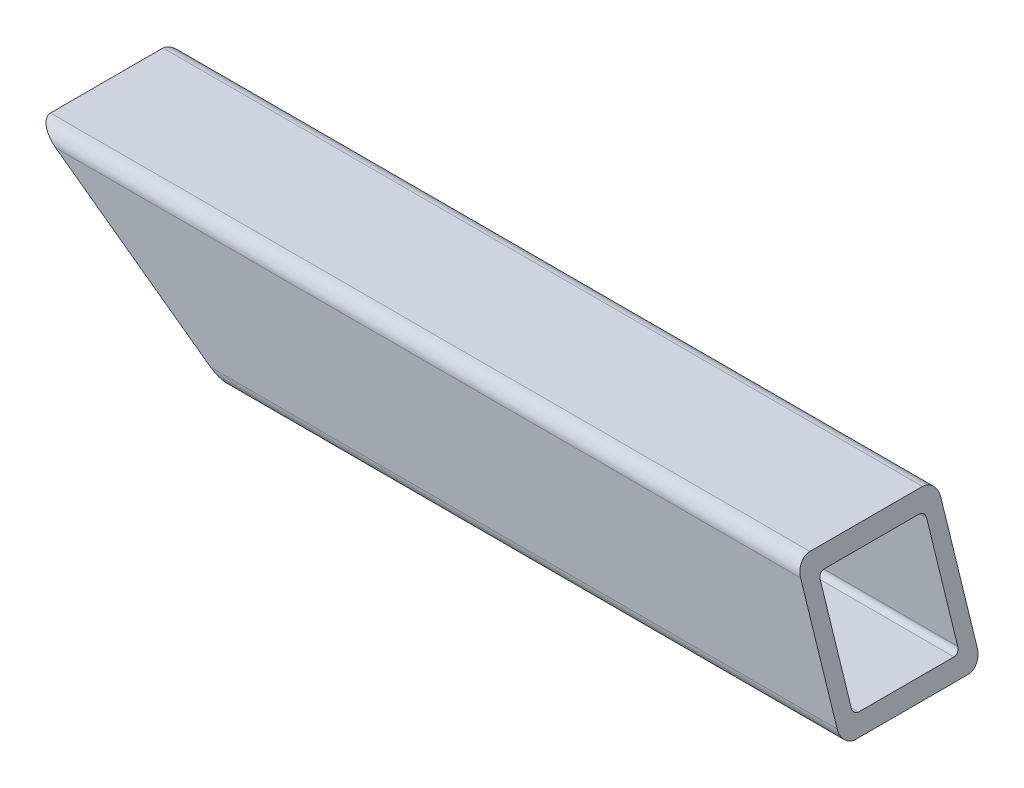
ISO-10303-21;
HEADER;
FILE_DESCRIPTION(('STEP AP214'),'2;1');
FILE_NAME('part.step','',(''),(''),'','','');
FILE_SCHEMA(('AUTOMOTIVE_DESIGN { 1 0 10303 214 1 1 1 1 }'));
ENDSEC;
DATA;
#1=APPLICATION_CONTEXT('core data for automotive mechanical design processes');
#2=APPLICATION_PROTOCOL_DEFINITION('international standard','automotive_design',2000,#1);
#3=PRODUCT_CONTEXT('',#1,'mechanical');
#4=PRODUCT('Part','Part','',(#3));
#5=PRODUCT_RELATED_PRODUCT_CATEGORY('part','',(#4));
#6=PRODUCT_DEFINITION_FORMATION('','',#4);
#7=PRODUCT_DEFINITION_CONTEXT('part definition',#1,'design');
#8=PRODUCT_DEFINITION('design','',#6,#7);
#9=PRODUCT_DEFINITION_SHAPE('','',#8);
#10=(LENGTH_UNIT() NAMED_UNIT(*) SI_UNIT(.MILLI.,.METRE.));
#11=(NAMED_UNIT(*) PLANE_ANGLE_UNIT() SI_UNIT($,.RADIAN.));
#12=(NAMED_UNIT(*) SI_UNIT($,.STERADIAN.) SOLID_ANGLE_UNIT());
#13=UNCERTAINTY_MEASURE_WITH_UNIT(LENGTH_MEASURE(1.E-05),#10,'distance_accuracy_value','');
#14=(GEOMETRIC_REPRESENTATION_CONTEXT(3) GLOBAL_UNCERTAINTY_ASSIGNED_CONTEXT((#13)) GLOBAL_UNIT_ASSIGNED_CONTEXT((#10,
#11,#12)) REPRESENTATION_CONTEXT('',''));
#15=CARTESIAN_POINT('',(0.,0.,0.));
#16=DIRECTION('',(0.,0.,1.));
#17=DIRECTION('',(1.,0.,0.));
#18=AXIS2_PLACEMENT_3D('',#15,#16,#17);
#19=CARTESIAN_POINT('',(-145.89,12.7,-12.7));
#20=DIRECTION('',(0.,0.,-1.));
#21=DIRECTION('',(0.,1.,0.));
#22=AXIS2_PLACEMENT_3D('',#19,#20,#21);
#23=PLANE('',#22);
#24=DIRECTION('',(-0.309016994374941,0.951056516295156,0.));
#25=VECTOR('',#24,1.);
#26=CARTESIAN_POINT('',(-8.25296028431564,12.7,-12.7));
#27=LINE('',#26,#25);
#28=CARTESIAN_POINT('',(-0.812299240582242,-10.2,-12.7));
#29=VERTEX_POINT('',#28);
#30=CARTESIAN_POINT('',(-7.44066104373339,10.2,-12.7));
#31=VERTEX_POINT('',#30);
#32=EDGE_CURVE('E146',#29,#31,#27,.T.);
#33=ORIENTED_EDGE('',*,*,#32,.F.);
#34=DIRECTION('',(1.,0.,0.));
#35=VECTOR('',#34,1.);
#36=CARTESIAN_POINT('',(-145.89,-10.2,-12.7));
#37=LINE('',#36,#35);
#38=CARTESIAN_POINT('',(-114.37085402121,-10.2,-12.7));
#39=VERTEX_POINT('',#38);
#40=EDGE_CURVE('E160',#29,#39,#37,.F.);
#41=ORIENTED_EDGE('',*,*,#40,.T.);
#42=DIRECTION('',(0.809016994374951,-0.587785252292468,0.));
#43=VECTOR('',#42,1.);
#44=CARTESIAN_POINT('',(-145.89,12.7,-12.7));
#45=LINE('',#44,#43);
#46=CARTESIAN_POINT('',(-142.449045198822,10.2,-12.7));
#47=VERTEX_POINT('',#46);
#48=EDGE_CURVE('E154',#47,#39,#45,.T.);
#49=ORIENTED_EDGE('',*,*,#48,.F.);
#50=DIRECTION('',(1.,0.,0.));
#51=VECTOR('',#50,1.);
#52=CARTESIAN_POINT('',(-145.89,10.2,-12.7));
#53=LINE('',#52,#51);
#54=EDGE_CURVE('E163',#47,#31,#53,.T.);
#55=ORIENTED_EDGE('',*,*,#54,.T.);
#56=EDGE_LOOP('',(#33,#41,#49,#55));
#57=FACE_BOUND('',#56,.T.);
#58=ADVANCED_FACE('F33',(#57),#23,.T.);
#59=CARTESIAN_POINT('',(-145.89,-12.7,12.7));
#60=DIRECTION('',(0.,-1.,0.));
#61=DIRECTION('',(0.,0.,-1.));
#62=AXIS2_PLACEMENT_3D('',#59,#60,#61);
#63=PLANE('',#62);
#64=DIRECTION('',(0.,0.,-1.));
#65=VECTOR('',#64,1.);
#66=CARTESIAN_POINT('',(-110.929899220032,-12.7,12.7));
#67=LINE('',#66,#65);
#68=CARTESIAN_POINT('',(-110.929899220032,-12.7,10.2));
#69=VERTEX_POINT('',#68);
#70=CARTESIAN_POINT('',(-110.929899220032,-12.7,-10.2));
#71=VERTEX_POINT('',#70);
#72=EDGE_CURVE('E225',#69,#71,#67,.T.);
#73=ORIENTED_EDGE('',*,*,#72,.T.);
#74=DIRECTION('',(1.,0.,0.));
#75=VECTOR('',#74,1.);
#76=CARTESIAN_POINT('',(-145.89,-12.7,-10.2));
#77=LINE('',#76,#75);
#78=CARTESIAN_POINT('',(0.,-12.7,-10.2));
#79=VERTEX_POINT('',#78);
#80=EDGE_CURVE('E173',#71,#79,#77,.T.);
#81=ORIENTED_EDGE('',*,*,#80,.T.);
#82=DIRECTION('',(0.,0.,-1.));
#83=VECTOR('',#82,1.);
#84=CARTESIAN_POINT('',(0.,-12.7,12.7));
#85=LINE('',#84,#83);
#86=CARTESIAN_POINT('',(0.,-12.7,10.2));
#87=VERTEX_POINT('',#86);
#88=EDGE_CURVE('E149',#87,#79,#85,.T.);
#89=ORIENTED_EDGE('',*,*,#88,.F.);
#90=DIRECTION('',(1.,0.,0.));
#91=VECTOR('',#90,1.);
#92=CARTESIAN_POINT('',(-145.89,-12.7,10.2));
#93=LINE('',#92,#91);
#94=EDGE_CURVE('E249',#87,#69,#93,.F.);
#95=ORIENTED_EDGE('',*,*,#94,.T.);
#96=EDGE_LOOP('',(#73,#81,#89,#95));
#97=FACE_BOUND('',#96,.T.);
#98=ADVANCED_FACE('F254',(#97),#63,.T.);
#99=CARTESIAN_POINT('',(-145.89,12.7,12.7));
#100=DIRECTION('',(0.,0.,1.));
#101=DIRECTION('',(0.,-1.,0.));
#102=AXIS2_PLACEMENT_3D('',#99,#100,#101);
#103=PLANE('',#102);
#104=DIRECTION('',(-0.309016994374941,0.951056516295156,0.));
#105=VECTOR('',#104,1.);
#106=CARTESIAN_POINT('',(-8.25296028431564,12.7,12.7));
#107=LINE('',#106,#105);
#108=CARTESIAN_POINT('',(-0.812299240582243,-10.2,12.7));
#109=VERTEX_POINT('',#108);
#110=CARTESIAN_POINT('',(-7.44066104373339,10.2,12.7));
#111=VERTEX_POINT('',#110);
#112=EDGE_CURVE('E164',#109,#111,#107,.T.);
#113=ORIENTED_EDGE('',*,*,#112,.T.);
#114=DIRECTION('',(1.,0.,0.));
#115=VECTOR('',#114,1.);
#116=CARTESIAN_POINT('',(-145.89,10.2,12.7));
#117=LINE('',#116,#115);
#118=CARTESIAN_POINT('',(-142.449045198822,10.2,12.7));
#119=VERTEX_POINT('',#118);
#120=EDGE_CURVE('E169',#111,#119,#117,.F.);
#121=ORIENTED_EDGE('',*,*,#120,.T.);
#122=DIRECTION('',(0.809016994374951,-0.587785252292468,0.));
#123=VECTOR('',#122,1.);
#124=CARTESIAN_POINT('',(-145.89,12.7,12.7));
#125=LINE('',#124,#123);
#126=CARTESIAN_POINT('',(-114.37085402121,-10.2,12.7));
#127=VERTEX_POINT('',#126);
#128=EDGE_CURVE('E258',#119,#127,#125,.T.);
#129=ORIENTED_EDGE('',*,*,#128,.T.);
#130=DIRECTION('',(1.,0.,0.));
#131=VECTOR('',#130,1.);
#132=CARTESIAN_POINT('',(-145.89,-10.2,12.7));
#133=LINE('',#132,#131);
#134=EDGE_CURVE('E171',#127,#109,#133,.T.);
#135=ORIENTED_EDGE('',*,*,#134,.T.);
#136=EDGE_LOOP('',(#113,#121,#129,#135));
#137=FACE_BOUND('',#136,.T.);
#138=ADVANCED_FACE('F291',(#137),#103,.T.);
#139=CARTESIAN_POINT('',(-145.89,12.7,12.7));
#140=DIRECTION('',(0.,1.,0.));
#141=DIRECTION('',(0.,0.,1.));
#142=AXIS2_PLACEMENT_3D('',#139,#140,#141);
#143=PLANE('',#142);
#144=DIRECTION('',(0.,0.,-1.));
#145=VECTOR('',#144,1.);
#146=CARTESIAN_POINT('',(-8.25296028431564,12.7,12.7));
#147=LINE('',#146,#145);
#148=CARTESIAN_POINT('',(-8.25296028431563,12.7,10.2));
#149=VERTEX_POINT('',#148);
#150=CARTESIAN_POINT('',(-8.25296028431561,12.7,-10.2));
#151=VERTEX_POINT('',#150);
#152=EDGE_CURVE('E48',#149,#151,#147,.T.);
#153=ORIENTED_EDGE('',*,*,#152,.T.);
#154=DIRECTION('',(1.,0.,0.));
#155=VECTOR('',#154,1.);
#156=CARTESIAN_POINT('',(-145.89,12.7,-10.2));
#157=LINE('',#156,#155);
#158=CARTESIAN_POINT('',(-145.89,12.7,-10.2));
#159=VERTEX_POINT('',#158);
#160=EDGE_CURVE('E182',#151,#159,#157,.F.);
#161=ORIENTED_EDGE('',*,*,#160,.T.);
#162=DIRECTION('',(0.,0.,1.));
#163=VECTOR('',#162,1.);
#164=CARTESIAN_POINT('',(-145.89,12.7,12.7));
#165=LINE('',#164,#163);
#166=CARTESIAN_POINT('',(-145.89,12.7,10.2));
#167=VERTEX_POINT('',#166);
#168=EDGE_CURVE('E246',#159,#167,#165,.T.);
#169=ORIENTED_EDGE('',*,*,#168,.T.);
#170=DIRECTION('',(1.,0.,0.));
#171=VECTOR('',#170,1.);
#172=CARTESIAN_POINT('',(-145.89,12.7,10.2));
#173=LINE('',#172,#171);
#174=EDGE_CURVE('E179',#167,#149,#173,.T.);
#175=ORIENTED_EDGE('',*,*,#174,.T.);
#176=EDGE_LOOP('',(#153,#161,#169,#175));
#177=FACE_BOUND('',#176,.T.);
#178=ADVANCED_FACE('F302',(#177),#143,.T.);
#179=CARTESIAN_POINT('',(-145.89,-9.652,-9.652));
#180=DIRECTION('',(0.,0.,-1.));
#181=DIRECTION('',(-1.,0.,0.));
#182=AXIS2_PLACEMENT_3D('',#179,#180,#181);
#183=PLANE('',#182);
#184=DIRECTION('',(1.,0.,0.));
#185=VECTOR('',#184,1.);
#186=CARTESIAN_POINT('',(0.,-8.652,-9.652));
#187=LINE('',#186,#185);
#188=CARTESIAN_POINT('',(-116.501493234099,-8.652,-9.652));
#189=VERTEX_POINT('',#188);
#190=CARTESIAN_POINT('',(-1.31527493035077,-8.652,-9.652));
#191=VERTEX_POINT('',#190);
#192=EDGE_CURVE('E186',#189,#191,#187,.T.);
#193=ORIENTED_EDGE('',*,*,#192,.T.);
#194=DIRECTION('',(-0.309016994374941,0.951056516295156,0.));
#195=VECTOR('',#194,1.);
#196=CARTESIAN_POINT('',(-14.8270400698126,32.9329371279011,-9.652));
#197=LINE('',#196,#195);
#198=CARTESIAN_POINT('',(-6.93768535396486,8.652,-9.652));
#199=VERTEX_POINT('',#198);
#200=EDGE_CURVE('E271',#191,#199,#197,.T.);
#201=ORIENTED_EDGE('',*,*,#200,.T.);
#202=DIRECTION('',(1.,0.,0.));
#203=VECTOR('',#202,1.);
#204=CARTESIAN_POINT('',(-145.89,8.652,-9.652));
#205=LINE('',#204,#203);
#206=CARTESIAN_POINT('',(-140.318405985933,8.652,-9.652));
#207=VERTEX_POINT('',#206);
#208=EDGE_CURVE('E184',#199,#207,#205,.F.);
#209=ORIENTED_EDGE('',*,*,#208,.T.);
#210=DIRECTION('',(0.809016994374951,-0.587785252292468,0.));
#211=VECTOR('',#210,1.);
#212=CARTESIAN_POINT('',(-135.260992373885,4.97757392913451,-9.652));
#213=LINE('',#212,#211);
#214=EDGE_CURVE('E233',#207,#189,#213,.T.);
#215=ORIENTED_EDGE('',*,*,#214,.T.);
#216=EDGE_LOOP('',(#193,#201,#209,#215));
#217=FACE_BOUND('',#216,.T.);
#218=ADVANCED_FACE('F341',(#217),#183,.F.);
#219=CARTESIAN_POINT('',(-145.89,-9.652,9.652));
#220=DIRECTION('',(0.,-1.,0.));
#221=DIRECTION('',(0.,0.,-1.));
#222=AXIS2_PLACEMENT_3D('',#219,#220,#221);
#223=PLANE('',#222);
#224=DIRECTION('',(1.,0.,0.));
#225=VECTOR('',#224,1.);
#226=CARTESIAN_POINT('',(0.,-9.652,8.652));
#227=LINE('',#226,#225);
#228=CARTESIAN_POINT('',(-115.125111313628,-9.652,8.652));
#229=VERTEX_POINT('',#228);
#230=CARTESIAN_POINT('',(-0.990355234117874,-9.652,8.652));
#231=VERTEX_POINT('',#230);
#232=EDGE_CURVE('E189',#229,#231,#227,.T.);
#233=ORIENTED_EDGE('',*,*,#232,.T.);
#234=DIRECTION('',(0.,0.,-1.));
#235=VECTOR('',#234,1.);
#236=CARTESIAN_POINT('',(-0.99035523411789,-9.652,9.652));
#237=LINE('',#236,#235);
#238=CARTESIAN_POINT('',(-0.990355234117889,-9.652,-8.652));
#239=VERTEX_POINT('',#238);
#240=EDGE_CURVE('E56',#231,#239,#237,.T.);
#241=ORIENTED_EDGE('',*,*,#240,.T.);
#242=DIRECTION('',(1.,0.,0.));
#243=VECTOR('',#242,1.);
#244=CARTESIAN_POINT('',(-145.89,-9.652,-8.652));
#245=LINE('',#244,#243);
#246=CARTESIAN_POINT('',(-115.125111313628,-9.652,-8.652));
#247=VERTEX_POINT('',#246);
#248=EDGE_CURVE('E192',#239,#247,#245,.F.);
#249=ORIENTED_EDGE('',*,*,#248,.T.);
#250=DIRECTION('',(0.,0.,1.));
#251=VECTOR('',#250,1.);
#252=CARTESIAN_POINT('',(-115.125111313628,-9.652,9.652));
#253=LINE('',#252,#251);
#254=EDGE_CURVE('E213',#247,#229,#253,.T.);
#255=ORIENTED_EDGE('',*,*,#254,.T.);
#256=EDGE_LOOP('',(#233,#241,#249,#255));
#257=FACE_BOUND('',#256,.T.);
#258=ADVANCED_FACE('F218',(#257),#223,.F.);
#259=CARTESIAN_POINT('',(-145.89,-9.652,9.652));
#260=DIRECTION('',(0.,0.,1.));
#261=DIRECTION('',(1.,0.,0.));
#262=AXIS2_PLACEMENT_3D('',#259,#260,#261);
#263=PLANE('',#262);
#264=DIRECTION('',(1.,0.,0.));
#265=VECTOR('',#264,1.);
#266=CARTESIAN_POINT('',(0.,8.652,9.652));
#267=LINE('',#266,#265);
#268=CARTESIAN_POINT('',(-140.318405985933,8.652,9.652));
#269=VERTEX_POINT('',#268);
#270=CARTESIAN_POINT('',(-6.93768535396486,8.652,9.652));
#271=VERTEX_POINT('',#270);
#272=EDGE_CURVE('E201',#269,#271,#267,.T.);
#273=ORIENTED_EDGE('',*,*,#272,.T.);
#274=DIRECTION('',(0.309016994374941,-0.951056516295156,0.));
#275=VECTOR('',#274,1.);
#276=CARTESIAN_POINT('',(-14.8270400698126,32.9329371279011,9.652));
#277=LINE('',#276,#275);
#278=CARTESIAN_POINT('',(-1.31527493035077,-8.652,9.652));
#279=VERTEX_POINT('',#278);
#280=EDGE_CURVE('E284',#271,#279,#277,.T.);
#281=ORIENTED_EDGE('',*,*,#280,.T.);
#282=DIRECTION('',(1.,0.,0.));
#283=VECTOR('',#282,1.);
#284=CARTESIAN_POINT('',(-145.89,-8.652,9.652));
#285=LINE('',#284,#283);
#286=CARTESIAN_POINT('',(-116.501493234099,-8.652,9.652));
#287=VERTEX_POINT('',#286);
#288=EDGE_CURVE('E199',#279,#287,#285,.F.);
#289=ORIENTED_EDGE('',*,*,#288,.T.);
#290=DIRECTION('',(-0.809016994374951,0.587785252292468,0.));
#291=VECTOR('',#290,1.);
#292=CARTESIAN_POINT('',(-135.260992373885,4.9775739291345,9.652));
#293=LINE('',#292,#291);
#294=EDGE_CURVE('E216',#287,#269,#293,.T.);
#295=ORIENTED_EDGE('',*,*,#294,.T.);
#296=EDGE_LOOP('',(#273,#281,#289,#295));
#297=FACE_BOUND('',#296,.T.);
#298=ADVANCED_FACE('F331',(#297),#263,.F.);
#299=CARTESIAN_POINT('',(-145.89,9.652,9.652));
#300=DIRECTION('',(0.,1.,0.));
#301=DIRECTION('',(0.,0.,1.));
#302=AXIS2_PLACEMENT_3D('',#299,#300,#301);
#303=PLANE('',#302);
#304=DIRECTION('',(1.,0.,0.));
#305=VECTOR('',#304,1.);
#306=CARTESIAN_POINT('',(0.,9.652,-8.652));
#307=LINE('',#306,#305);
#308=CARTESIAN_POINT('',(-141.694787906404,9.652,-8.652));
#309=VERTEX_POINT('',#308);
#310=CARTESIAN_POINT('',(-7.26260505019777,9.652,-8.652));
#311=VERTEX_POINT('',#310);
#312=EDGE_CURVE('E196',#309,#311,#307,.T.);
#313=ORIENTED_EDGE('',*,*,#312,.T.);
#314=DIRECTION('',(0.,0.,1.));
#315=VECTOR('',#314,1.);
#316=CARTESIAN_POINT('',(-7.26260505019777,9.652,9.652));
#317=LINE('',#316,#315);
#318=CARTESIAN_POINT('',(-7.26260505019774,9.652,8.652));
#319=VERTEX_POINT('',#318);
#320=EDGE_CURVE('E274',#311,#319,#317,.T.);
#321=ORIENTED_EDGE('',*,*,#320,.T.);
#322=DIRECTION('',(1.,0.,0.));
#323=VECTOR('',#322,1.);
#324=CARTESIAN_POINT('',(-145.89,9.652,8.652));
#325=LINE('',#324,#323);
#326=CARTESIAN_POINT('',(-141.694787906404,9.652,8.652));
#327=VERTEX_POINT('',#326);
#328=EDGE_CURVE('E194',#319,#327,#325,.F.);
#329=ORIENTED_EDGE('',*,*,#328,.T.);
#330=DIRECTION('',(0.,0.,-1.));
#331=VECTOR('',#330,1.);
#332=CARTESIAN_POINT('',(-141.694787906404,9.652,9.652));
#333=LINE('',#332,#331);
#334=EDGE_CURVE('E230',#327,#309,#333,.T.);
#335=ORIENTED_EDGE('',*,*,#334,.T.);
#336=EDGE_LOOP('',(#313,#321,#329,#335));
#337=FACE_BOUND('',#336,.T.);
#338=ADVANCED_FACE('F327',(#337),#303,.F.);
#339=CARTESIAN_POINT('',(-145.89,-10.2,-10.2));
#340=DIRECTION('',(1.,0.,0.));
#341=DIRECTION('',(0.,0.,-1.));
#342=AXIS2_PLACEMENT_3D('',#339,#340,#341);
#343=CYLINDRICAL_SURFACE('',#342,2.5);
#344=CARTESIAN_POINT('',(-0.812299240582209,-10.2,-10.2));
#345=DIRECTION('',(-0.951056516295156,-0.309016994374941,0.));
#346=DIRECTION('',(0.309016994374941,-0.951056516295156,0.));
#347=AXIS2_PLACEMENT_3D('',#344,#345,#346);
#348=ELLIPSE('',#347,2.62865556059566,2.5);
#349=EDGE_CURVE('E143',#79,#29,#348,.F.);
#350=ORIENTED_EDGE('',*,*,#349,.F.);
#351=ORIENTED_EDGE('',*,*,#80,.F.);
#352=CARTESIAN_POINT('',(-114.37085402121,-10.2,-10.2));
#353=DIRECTION('',(0.587785252292468,0.809016994374951,0.));
#354=DIRECTION('',(0.809016994374951,-0.587785252292468,0.));
#355=AXIS2_PLACEMENT_3D('',#352,#353,#354);
#356=ELLIPSE('',#355,4.25325404176023,2.5);
#357=EDGE_CURVE('E168',#39,#71,#356,.F.);
#358=ORIENTED_EDGE('',*,*,#357,.F.);
#359=ORIENTED_EDGE('',*,*,#40,.F.);
#360=EDGE_LOOP('',(#350,#351,#358,#359));
#361=FACE_BOUND('',#360,.T.);
#362=ADVANCED_FACE('F167',(#361),#343,.T.);
#363=CARTESIAN_POINT('',(-145.89,-10.2,10.2));
#364=DIRECTION('',(1.,0.,0.));
#365=DIRECTION('',(0.,0.,-1.));
#366=AXIS2_PLACEMENT_3D('',#363,#364,#365);
#367=CYLINDRICAL_SURFACE('',#366,2.5);
#368=CARTESIAN_POINT('',(-0.812299240582209,-10.2,10.2));
#369=DIRECTION('',(-0.951056516295156,-0.309016994374941,0.));
#370=DIRECTION('',(0.309016994374941,-0.951056516295156,0.));
#371=AXIS2_PLACEMENT_3D('',#368,#369,#370);
#372=ELLIPSE('',#371,2.62865556059566,2.5);
#373=EDGE_CURVE('E155',#109,#87,#372,.F.);
#374=ORIENTED_EDGE('',*,*,#373,.F.);
#375=ORIENTED_EDGE('',*,*,#134,.F.);
#376=CARTESIAN_POINT('',(-114.37085402121,-10.2,10.2));
#377=DIRECTION('',(0.587785252292468,0.809016994374951,0.));
#378=DIRECTION('',(0.809016994374951,-0.587785252292468,0.));
#379=AXIS2_PLACEMENT_3D('',#376,#377,#378);
#380=ELLIPSE('',#379,4.25325404176023,2.5);
#381=EDGE_CURVE('E243',#69,#127,#380,.F.);
#382=ORIENTED_EDGE('',*,*,#381,.F.);
#383=ORIENTED_EDGE('',*,*,#94,.F.);
#384=EDGE_LOOP('',(#374,#375,#382,#383));
#385=FACE_BOUND('',#384,.T.);
#386=ADVANCED_FACE('F307',(#385),#367,.T.);
#387=CARTESIAN_POINT('',(-145.89,10.2,-10.2));
#388=DIRECTION('',(1.,0.,0.));
#389=DIRECTION('',(0.,0.,-1.));
#390=AXIS2_PLACEMENT_3D('',#387,#388,#389);
#391=CYLINDRICAL_SURFACE('',#390,2.5);
#392=CARTESIAN_POINT('',(-7.44066104373337,10.2,-10.2));
#393=DIRECTION('',(-0.951056516295156,-0.309016994374941,0.));
#394=DIRECTION('',(0.309016994374941,-0.951056516295156,0.));
#395=AXIS2_PLACEMENT_3D('',#392,#393,#394);
#396=ELLIPSE('',#395,2.62865556059566,2.5);
#397=EDGE_CURVE('E264',#31,#151,#396,.F.);
#398=ORIENTED_EDGE('',*,*,#397,.F.);
#399=ORIENTED_EDGE('',*,*,#54,.F.);
#400=CARTESIAN_POINT('',(-142.449045198822,10.2,-10.2));
#401=DIRECTION('',(0.587785252292468,0.809016994374951,0.));
#402=DIRECTION('',(0.809016994374951,-0.587785252292468,0.));
#403=AXIS2_PLACEMENT_3D('',#400,#401,#402);
#404=ELLIPSE('',#403,4.25325404176023,2.5);
#405=EDGE_CURVE('E241',#159,#47,#404,.F.);
#406=ORIENTED_EDGE('',*,*,#405,.F.);
#407=ORIENTED_EDGE('',*,*,#160,.F.);
#408=EDGE_LOOP('',(#398,#399,#406,#407));
#409=FACE_BOUND('',#408,.T.);
#410=ADVANCED_FACE('F305',(#409),#391,.T.);
#411=CARTESIAN_POINT('',(-145.89,10.2,10.2));
#412=DIRECTION('',(1.,0.,0.));
#413=DIRECTION('',(0.,0.,-1.));
#414=AXIS2_PLACEMENT_3D('',#411,#412,#413);
#415=CYLINDRICAL_SURFACE('',#414,2.5);
#416=CARTESIAN_POINT('',(-7.44066104373337,10.2,10.2));
#417=DIRECTION('',(-0.951056516295156,-0.309016994374941,0.));
#418=DIRECTION('',(0.309016994374941,-0.951056516295156,0.));
#419=AXIS2_PLACEMENT_3D('',#416,#417,#418);
#420=ELLIPSE('',#419,2.62865556059566,2.5);
#421=EDGE_CURVE('E266',#149,#111,#420,.F.);
#422=ORIENTED_EDGE('',*,*,#421,.F.);
#423=ORIENTED_EDGE('',*,*,#174,.F.);
#424=CARTESIAN_POINT('',(-142.449045198822,10.2,10.2));
#425=DIRECTION('',(0.587785252292468,0.809016994374951,0.));
#426=DIRECTION('',(0.809016994374951,-0.587785252292468,0.));
#427=AXIS2_PLACEMENT_3D('',#424,#425,#426);
#428=ELLIPSE('',#427,4.25325404176023,2.5);
#429=EDGE_CURVE('E239',#119,#167,#428,.F.);
#430=ORIENTED_EDGE('',*,*,#429,.F.);
#431=ORIENTED_EDGE('',*,*,#120,.F.);
#432=EDGE_LOOP('',(#422,#423,#430,#431));
#433=FACE_BOUND('',#432,.T.);
#434=ADVANCED_FACE('F297',(#433),#415,.T.);
#435=CARTESIAN_POINT('',(-145.89,-8.652,-8.652));
#436=DIRECTION('',(-1.,0.,0.));
#437=DIRECTION('',(0.,0.,1.));
#438=AXIS2_PLACEMENT_3D('',#435,#436,#437);
#439=CYLINDRICAL_SURFACE('',#438,1.);
#440=ORIENTED_EDGE('',*,*,#248,.F.);
#441=CARTESIAN_POINT('',(-1.31527493035077,-8.652,-8.652));
#442=DIRECTION('',(-0.951056516295156,-0.309016994374941,0.));
#443=DIRECTION('',(-0.309016994374941,0.951056516295156,0.));
#444=AXIS2_PLACEMENT_3D('',#441,#442,#443);
#445=ELLIPSE('',#444,1.05146222423827,1.);
#446=EDGE_CURVE('E277',#239,#191,#445,.F.);
#447=ORIENTED_EDGE('',*,*,#446,.T.);
#448=ORIENTED_EDGE('',*,*,#192,.F.);
#449=CARTESIAN_POINT('',(-116.501493234099,-8.652,-8.652));
#450=DIRECTION('',(0.587785252292468,0.809016994374951,0.));
#451=DIRECTION('',(-0.809016994374951,0.587785252292468,0.));
#452=AXIS2_PLACEMENT_3D('',#449,#450,#451);
#453=ELLIPSE('',#452,1.70130161670409,1.);
#454=EDGE_CURVE('E223',#189,#247,#453,.F.);
#455=ORIENTED_EDGE('',*,*,#454,.T.);
#456=EDGE_LOOP('',(#440,#447,#448,#455));
#457=FACE_BOUND('',#456,.T.);
#458=ADVANCED_FACE('F313',(#457),#439,.F.);
#459=CARTESIAN_POINT('',(-145.89,8.652,-8.652));
#460=DIRECTION('',(-1.,0.,0.));
#461=DIRECTION('',(0.,0.,1.));
#462=AXIS2_PLACEMENT_3D('',#459,#460,#461);
#463=CYLINDRICAL_SURFACE('',#462,1.);
#464=ORIENTED_EDGE('',*,*,#208,.F.);
#465=CARTESIAN_POINT('',(-6.93768535396486,8.652,-8.652));
#466=DIRECTION('',(-0.951056516295156,-0.309016994374941,0.));
#467=DIRECTION('',(-0.309016994374941,0.951056516295156,0.));
#468=AXIS2_PLACEMENT_3D('',#465,#466,#467);
#469=ELLIPSE('',#468,1.05146222423827,1.);
#470=EDGE_CURVE('E268',#199,#311,#469,.F.);
#471=ORIENTED_EDGE('',*,*,#470,.T.);
#472=ORIENTED_EDGE('',*,*,#312,.F.);
#473=CARTESIAN_POINT('',(-140.318405985933,8.652,-8.652));
#474=DIRECTION('',(0.587785252292468,0.809016994374951,0.));
#475=DIRECTION('',(-0.809016994374951,0.587785252292468,0.));
#476=AXIS2_PLACEMENT_3D('',#473,#474,#475);
#477=ELLIPSE('',#476,1.70130161670409,1.);
#478=EDGE_CURVE('E236',#309,#207,#477,.F.);
#479=ORIENTED_EDGE('',*,*,#478,.T.);
#480=EDGE_LOOP('',(#464,#471,#472,#479));
#481=FACE_BOUND('',#480,.T.);
#482=ADVANCED_FACE('F396',(#481),#463,.F.);
#483=CARTESIAN_POINT('',(-145.89,8.652,8.652));
#484=DIRECTION('',(-1.,0.,0.));
#485=DIRECTION('',(0.,0.,1.));
#486=AXIS2_PLACEMENT_3D('',#483,#484,#485);
#487=CYLINDRICAL_SURFACE('',#486,1.);
#488=ORIENTED_EDGE('',*,*,#328,.F.);
#489=CARTESIAN_POINT('',(-6.93768535396486,8.652,8.652));
#490=DIRECTION('',(-0.951056516295156,-0.309016994374941,0.));
#491=DIRECTION('',(-0.309016994374941,0.951056516295156,0.));
#492=AXIS2_PLACEMENT_3D('',#489,#490,#491);
#493=ELLIPSE('',#492,1.05146222423827,1.);
#494=EDGE_CURVE('E280',#319,#271,#493,.F.);
#495=ORIENTED_EDGE('',*,*,#494,.T.);
#496=ORIENTED_EDGE('',*,*,#272,.F.);
#497=CARTESIAN_POINT('',(-140.318405985933,8.652,8.652));
#498=DIRECTION('',(0.587785252292468,0.809016994374951,0.));
#499=DIRECTION('',(-0.809016994374951,0.587785252292468,0.));
#500=AXIS2_PLACEMENT_3D('',#497,#498,#499);
#501=ELLIPSE('',#500,1.70130161670409,1.);
#502=EDGE_CURVE('E220',#269,#327,#501,.F.);
#503=ORIENTED_EDGE('',*,*,#502,.T.);
#504=EDGE_LOOP('',(#488,#495,#496,#503));
#505=FACE_BOUND('',#504,.T.);
#506=ADVANCED_FACE('F406',(#505),#487,.F.);
#507=CARTESIAN_POINT('',(-145.89,-8.652,8.652));
#508=DIRECTION('',(-1.,0.,0.));
#509=DIRECTION('',(0.,0.,1.));
#510=AXIS2_PLACEMENT_3D('',#507,#508,#509);
#511=CYLINDRICAL_SURFACE('',#510,1.);
#512=ORIENTED_EDGE('',*,*,#288,.F.);
#513=CARTESIAN_POINT('',(-1.31527493035077,-8.652,8.652));
#514=DIRECTION('',(-0.951056516295156,-0.309016994374941,0.));
#515=DIRECTION('',(-0.309016994374941,0.951056516295156,0.));
#516=AXIS2_PLACEMENT_3D('',#513,#514,#515);
#517=ELLIPSE('',#516,1.05146222423827,1.);
#518=EDGE_CURVE('E11',#279,#231,#517,.F.);
#519=ORIENTED_EDGE('',*,*,#518,.T.);
#520=ORIENTED_EDGE('',*,*,#232,.F.);
#521=CARTESIAN_POINT('',(-116.501493234099,-8.652,8.652));
#522=DIRECTION('',(0.587785252292468,0.809016994374951,0.));
#523=DIRECTION('',(-0.809016994374951,0.587785252292468,0.));
#524=AXIS2_PLACEMENT_3D('',#521,#522,#523);
#525=ELLIPSE('',#524,1.70130161670409,1.);
#526=EDGE_CURVE('E41',#229,#287,#525,.F.);
#527=ORIENTED_EDGE('',*,*,#526,.T.);
#528=EDGE_LOOP('',(#512,#519,#520,#527));
#529=FACE_BOUND('',#528,.T.);
#530=ADVANCED_FACE('F35',(#529),#511,.F.);
#531=CARTESIAN_POINT('',(-145.89,12.7,12.7));
#532=DIRECTION('',(0.587785252292468,0.809016994374951,0.));
#533=DIRECTION('',(-0.809016994374951,0.587785252292468,0.));
#534=AXIS2_PLACEMENT_3D('',#531,#532,#533);
#535=PLANE('',#534);
#536=ORIENTED_EDGE('',*,*,#357,.T.);
#537=ORIENTED_EDGE('',*,*,#72,.F.);
#538=ORIENTED_EDGE('',*,*,#381,.T.);
#539=ORIENTED_EDGE('',*,*,#128,.F.);
#540=ORIENTED_EDGE('',*,*,#429,.T.);
#541=ORIENTED_EDGE('',*,*,#168,.F.);
#542=ORIENTED_EDGE('',*,*,#405,.T.);
#543=ORIENTED_EDGE('',*,*,#48,.T.);
#544=EDGE_LOOP('',(#536,#537,#538,#539,#540,#541,#542,#543));
#545=FACE_BOUND('',#544,.T.);
#546=ORIENTED_EDGE('',*,*,#334,.F.);
#547=ORIENTED_EDGE('',*,*,#502,.F.);
#548=ORIENTED_EDGE('',*,*,#294,.F.);
#549=ORIENTED_EDGE('',*,*,#526,.F.);
#550=ORIENTED_EDGE('',*,*,#254,.F.);
#551=ORIENTED_EDGE('',*,*,#454,.F.);
#552=ORIENTED_EDGE('',*,*,#214,.F.);
#553=ORIENTED_EDGE('',*,*,#478,.F.);
#554=EDGE_LOOP('',(#546,#547,#548,#549,#550,#551,#552,#553));
#555=FACE_BOUND('',#554,.T.);
#556=ADVANCED_FACE('F212',(#545,#555),#535,.F.);
#557=CARTESIAN_POINT('',(-8.25296028431564,12.7,12.7));
#558=DIRECTION('',(-0.951056516295156,-0.309016994374941,0.));
#559=DIRECTION('',(0.309016994374941,-0.951056516295156,0.));
#560=AXIS2_PLACEMENT_3D('',#557,#558,#559);
#561=PLANE('',#560);
#562=ORIENTED_EDGE('',*,*,#349,.T.);
#563=ORIENTED_EDGE('',*,*,#32,.T.);
#564=ORIENTED_EDGE('',*,*,#397,.T.);
#565=ORIENTED_EDGE('',*,*,#152,.F.);
#566=ORIENTED_EDGE('',*,*,#421,.T.);
#567=ORIENTED_EDGE('',*,*,#112,.F.);
#568=ORIENTED_EDGE('',*,*,#373,.T.);
#569=ORIENTED_EDGE('',*,*,#88,.T.);
#570=EDGE_LOOP('',(#562,#563,#564,#565,#566,#567,#568,#569));
#571=FACE_BOUND('',#570,.T.);
#572=ORIENTED_EDGE('',*,*,#200,.F.);
#573=ORIENTED_EDGE('',*,*,#446,.F.);
#574=ORIENTED_EDGE('',*,*,#240,.F.);
#575=ORIENTED_EDGE('',*,*,#518,.F.);
#576=ORIENTED_EDGE('',*,*,#280,.F.);
#577=ORIENTED_EDGE('',*,*,#494,.F.);
#578=ORIENTED_EDGE('',*,*,#320,.F.);
#579=ORIENTED_EDGE('',*,*,#470,.F.);
#580=EDGE_LOOP('',(#572,#573,#574,#575,#576,#577,#578,#579));
#581=FACE_BOUND('',#580,.T.);
#582=ADVANCED_FACE('F145',(#571,#581),#561,.F.);
#583=CLOSED_SHELL('',(#58,#98,#138,#178,#218,#258,#298,#338,#362,#386,#410,#434,#458,#482,#506,
#530,#556,#582));
#584=MANIFOLD_SOLID_BREP('B2',#583);
#585=ADVANCED_BREP_SHAPE_REPRESENTATION('',(#18,#584),#14);
#586=SHAPE_DEFINITION_REPRESENTATION(#9,#585);
ENDSEC;
END-ISO-10303-21;
